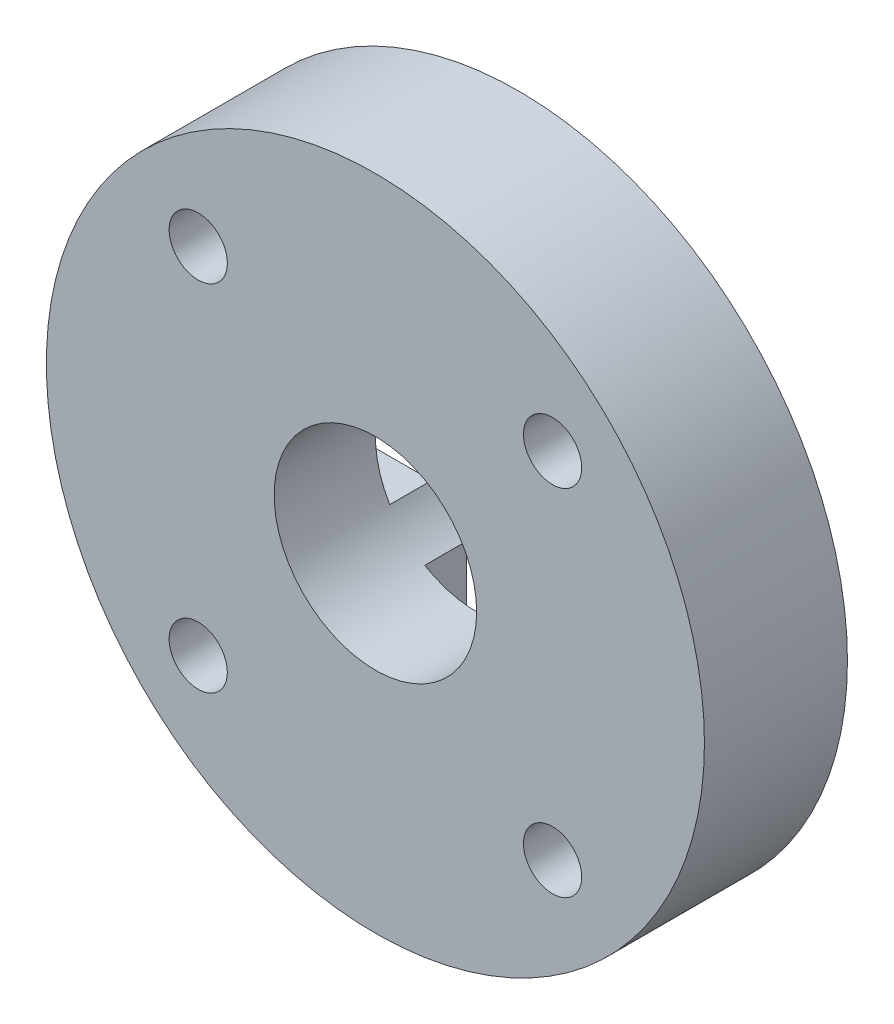
ISO-10303-21;
HEADER;
FILE_DESCRIPTION(('STEP AP214'),'2;1');
FILE_NAME('part.step','',(''),(''),'','','');
FILE_SCHEMA(('AUTOMOTIVE_DESIGN { 1 0 10303 214 1 1 1 1 }'));
ENDSEC;
DATA;
#1=APPLICATION_CONTEXT('core data for automotive mechanical design processes');
#2=APPLICATION_PROTOCOL_DEFINITION('international standard','automotive_design',2000,#1);
#3=PRODUCT_CONTEXT('',#1,'mechanical');
#4=PRODUCT('Part','Part','',(#3));
#5=PRODUCT_RELATED_PRODUCT_CATEGORY('part','',(#4));
#6=PRODUCT_DEFINITION_FORMATION('','',#4);
#7=PRODUCT_DEFINITION_CONTEXT('part definition',#1,'design');
#8=PRODUCT_DEFINITION('design','',#6,#7);
#9=PRODUCT_DEFINITION_SHAPE('','',#8);
#10=(LENGTH_UNIT() NAMED_UNIT(*) SI_UNIT(.MILLI.,.METRE.));
#11=(NAMED_UNIT(*) PLANE_ANGLE_UNIT() SI_UNIT($,.RADIAN.));
#12=(NAMED_UNIT(*) SI_UNIT($,.STERADIAN.) SOLID_ANGLE_UNIT());
#13=UNCERTAINTY_MEASURE_WITH_UNIT(LENGTH_MEASURE(1.E-05),#10,'distance_accuracy_value','');
#14=(GEOMETRIC_REPRESENTATION_CONTEXT(3) GLOBAL_UNCERTAINTY_ASSIGNED_CONTEXT((#13)) GLOBAL_UNIT_ASSIGNED_CONTEXT((#10,
#11,#12)) REPRESENTATION_CONTEXT('',''));
#15=CARTESIAN_POINT('',(0.,0.,0.));
#16=DIRECTION('',(0.,0.,1.));
#17=DIRECTION('',(1.,0.,0.));
#18=AXIS2_PLACEMENT_3D('',#15,#16,#17);
#19=CARTESIAN_POINT('',(0.,0.,-1.65));
#20=DIRECTION('',(0.,0.,1.));
#21=DIRECTION('',(1.,0.,0.));
#22=AXIS2_PLACEMENT_3D('',#19,#20,#21);
#23=PLANE('',#22);
#24=CARTESIAN_POINT('',(7.,-7.,-1.65));
#25=DIRECTION('',(0.,0.,1.));
#26=DIRECTION('',(1.,0.,0.));
#27=AXIS2_PLACEMENT_3D('',#24,#25,#26);
#28=CIRCLE('',#27,1.15);
#29=CARTESIAN_POINT('',(8.15,-7.,-1.65));
#30=VERTEX_POINT('',#29);
#31=EDGE_CURVE('E268',#30,#30,#28,.F.);
#32=ORIENTED_EDGE('',*,*,#31,.F.);
#33=EDGE_LOOP('',(#32));
#34=FACE_BOUND('',#33,.T.);
#35=CARTESIAN_POINT('',(-7.,-7.,-1.65));
#36=DIRECTION('',(0.,0.,1.));
#37=DIRECTION('',(1.,0.,0.));
#38=AXIS2_PLACEMENT_3D('',#35,#36,#37);
#39=CIRCLE('',#38,1.15);
#40=CARTESIAN_POINT('',(-5.85,-7.,-1.65));
#41=VERTEX_POINT('',#40);
#42=EDGE_CURVE('E289',#41,#41,#39,.F.);
#43=ORIENTED_EDGE('',*,*,#42,.F.);
#44=EDGE_LOOP('',(#43));
#45=FACE_BOUND('',#44,.T.);
#46=CARTESIAN_POINT('',(-7.,7.,-1.65));
#47=DIRECTION('',(0.,0.,1.));
#48=DIRECTION('',(1.,0.,0.));
#49=AXIS2_PLACEMENT_3D('',#46,#47,#48);
#50=CIRCLE('',#49,1.15);
#51=CARTESIAN_POINT('',(-5.85,7.,-1.65));
#52=VERTEX_POINT('',#51);
#53=EDGE_CURVE('E291',#52,#52,#50,.F.);
#54=ORIENTED_EDGE('',*,*,#53,.F.);
#55=EDGE_LOOP('',(#54));
#56=FACE_BOUND('',#55,.T.);
#57=CARTESIAN_POINT('',(7.,7.,-1.65));
#58=DIRECTION('',(0.,0.,1.));
#59=DIRECTION('',(1.,0.,0.));
#60=AXIS2_PLACEMENT_3D('',#57,#58,#59);
#61=CIRCLE('',#60,1.15);
#62=CARTESIAN_POINT('',(8.15,7.,-1.65));
#63=VERTEX_POINT('',#62);
#64=EDGE_CURVE('E300',#63,#63,#61,.F.);
#65=ORIENTED_EDGE('',*,*,#64,.F.);
#66=EDGE_LOOP('',(#65));
#67=FACE_BOUND('',#66,.T.);
#68=CARTESIAN_POINT('',(0.,0.,-1.65));
#69=DIRECTION('',(0.,0.,1.));
#70=DIRECTION('',(1.,0.,0.));
#71=AXIS2_PLACEMENT_3D('',#68,#69,#70);
#72=CIRCLE('',#71,13.);
#73=CARTESIAN_POINT('',(13.,0.,-1.65));
#74=VERTEX_POINT('',#73);
#75=EDGE_CURVE('E215',#74,#74,#72,.T.);
#76=ORIENTED_EDGE('',*,*,#75,.F.);
#77=EDGE_LOOP('',(#76));
#78=FACE_BOUND('',#77,.T.);
#79=DIRECTION('',(-1.,0.,0.));
#80=VECTOR('',#79,1.);
#81=CARTESIAN_POINT('',(-8.15,2.05,-1.65));
#82=LINE('',#81,#80);
#83=CARTESIAN_POINT('',(8.15,2.05,-1.65));
#84=VERTEX_POINT('',#83);
#85=CARTESIAN_POINT('',(3.43474889911912,2.05,-1.65));
#86=VERTEX_POINT('',#85);
#87=EDGE_CURVE('E172',#84,#86,#82,.T.);
#88=ORIENTED_EDGE('',*,*,#87,.T.);
#89=CARTESIAN_POINT('',(0.,0.,-1.65));
#90=DIRECTION('',(0.,0.,1.));
#91=DIRECTION('',(1.,0.,0.));
#92=AXIS2_PLACEMENT_3D('',#89,#90,#91);
#93=CIRCLE('',#92,4.);
#94=CARTESIAN_POINT('',(2.05,3.43474889911912,-1.65));
#95=VERTEX_POINT('',#94);
#96=EDGE_CURVE('E151',#86,#95,#93,.T.);
#97=ORIENTED_EDGE('',*,*,#96,.T.);
#98=DIRECTION('',(0.,1.,0.));
#99=VECTOR('',#98,1.);
#100=CARTESIAN_POINT('',(2.05,-8.15,-1.65));
#101=LINE('',#100,#99);
#102=CARTESIAN_POINT('',(2.05,8.15,-1.65));
#103=VERTEX_POINT('',#102);
#104=EDGE_CURVE('E226',#95,#103,#101,.T.);
#105=ORIENTED_EDGE('',*,*,#104,.T.);
#106=CARTESIAN_POINT('',(0.,8.15,-1.65));
#107=DIRECTION('',(0.,0.,1.));
#108=DIRECTION('',(1.,0.,0.));
#109=AXIS2_PLACEMENT_3D('',#106,#107,#108);
#110=CIRCLE('',#109,2.05);
#111=CARTESIAN_POINT('',(-2.05,8.15,-1.65));
#112=VERTEX_POINT('',#111);
#113=EDGE_CURVE('E274',#103,#112,#110,.T.);
#114=ORIENTED_EDGE('',*,*,#113,.T.);
#115=DIRECTION('',(0.,-1.,0.));
#116=VECTOR('',#115,1.);
#117=CARTESIAN_POINT('',(-2.05,-8.15,-1.65));
#118=LINE('',#117,#116);
#119=CARTESIAN_POINT('',(-2.05,3.43474889911912,-1.65));
#120=VERTEX_POINT('',#119);
#121=EDGE_CURVE('E238',#112,#120,#118,.T.);
#122=ORIENTED_EDGE('',*,*,#121,.T.);
#123=CARTESIAN_POINT('',(-3.43474889911912,2.05,-1.65));
#124=VERTEX_POINT('',#123);
#125=EDGE_CURVE('E62',#120,#124,#93,.T.);
#126=ORIENTED_EDGE('',*,*,#125,.T.);
#127=CARTESIAN_POINT('',(-8.15,2.05,-1.65));
#128=VERTEX_POINT('',#127);
#129=EDGE_CURVE('E187',#124,#128,#82,.T.);
#130=ORIENTED_EDGE('',*,*,#129,.T.);
#131=CARTESIAN_POINT('',(-8.15,0.,-1.65));
#132=DIRECTION('',(0.,0.,1.));
#133=DIRECTION('',(1.,0.,0.));
#134=AXIS2_PLACEMENT_3D('',#131,#132,#133);
#135=CIRCLE('',#134,2.05);
#136=CARTESIAN_POINT('',(-8.15,-2.05,-1.65));
#137=VERTEX_POINT('',#136);
#138=EDGE_CURVE('E278',#128,#137,#135,.T.);
#139=ORIENTED_EDGE('',*,*,#138,.T.);
#140=DIRECTION('',(1.,0.,0.));
#141=VECTOR('',#140,1.);
#142=CARTESIAN_POINT('',(-8.15,-2.05,-1.65));
#143=LINE('',#142,#141);
#144=CARTESIAN_POINT('',(-3.43474889911912,-2.05,-1.65));
#145=VERTEX_POINT('',#144);
#146=EDGE_CURVE('E194',#137,#145,#143,.T.);
#147=ORIENTED_EDGE('',*,*,#146,.T.);
#148=CARTESIAN_POINT('',(-2.05,-3.43474889911912,-1.65));
#149=VERTEX_POINT('',#148);
#150=EDGE_CURVE('E637',#145,#149,#93,.T.);
#151=ORIENTED_EDGE('',*,*,#150,.T.);
#152=CARTESIAN_POINT('',(-2.05,-8.15,-1.65));
#153=VERTEX_POINT('',#152);
#154=EDGE_CURVE('E53',#149,#153,#118,.T.);
#155=ORIENTED_EDGE('',*,*,#154,.T.);
#156=CARTESIAN_POINT('',(0.,-8.15,-1.65));
#157=DIRECTION('',(0.,0.,1.));
#158=DIRECTION('',(1.,0.,0.));
#159=AXIS2_PLACEMENT_3D('',#156,#157,#158);
#160=CIRCLE('',#159,2.05);
#161=CARTESIAN_POINT('',(2.05,-8.15,-1.65));
#162=VERTEX_POINT('',#161);
#163=EDGE_CURVE('E270',#153,#162,#160,.T.);
#164=ORIENTED_EDGE('',*,*,#163,.T.);
#165=CARTESIAN_POINT('',(2.05,-3.43474889911912,-1.65));
#166=VERTEX_POINT('',#165);
#167=EDGE_CURVE('E231',#162,#166,#101,.T.);
#168=ORIENTED_EDGE('',*,*,#167,.T.);
#169=CARTESIAN_POINT('',(3.43474889911912,-2.05,-1.65));
#170=VERTEX_POINT('',#169);
#171=EDGE_CURVE('E67',#166,#170,#93,.T.);
#172=ORIENTED_EDGE('',*,*,#171,.T.);
#173=CARTESIAN_POINT('',(8.15,-2.05,-1.65));
#174=VERTEX_POINT('',#173);
#175=EDGE_CURVE('E354',#170,#174,#143,.T.);
#176=ORIENTED_EDGE('',*,*,#175,.T.);
#177=CARTESIAN_POINT('',(8.15,0.,-1.65));
#178=DIRECTION('',(0.,0.,1.));
#179=DIRECTION('',(1.,0.,0.));
#180=AXIS2_PLACEMENT_3D('',#177,#178,#179);
#181=CIRCLE('',#180,2.05);
#182=EDGE_CURVE('E182',#174,#84,#181,.T.);
#183=ORIENTED_EDGE('',*,*,#182,.T.);
#184=EDGE_LOOP('',(#88,#97,#105,#114,#122,#126,#130,#139,#147,#151,#155,#164,#168,#172,#176,#183));
#185=FACE_BOUND('',#184,.T.);
#186=ADVANCED_FACE('F44',(#34,#45,#56,#67,#78,#185),#23,.F.);
#187=CARTESIAN_POINT('',(-8.15,-2.05,0.));
#188=DIRECTION('',(0.,1.,0.));
#189=DIRECTION('',(0.,0.,1.));
#190=AXIS2_PLACEMENT_3D('',#187,#188,#189);
#191=PLANE('',#190);
#192=ORIENTED_EDGE('',*,*,#175,.F.);
#193=DIRECTION('',(0.,0.,-1.));
#194=VECTOR('',#193,1.);
#195=CARTESIAN_POINT('',(3.43474889911912,-2.05,0.));
#196=LINE('',#195,#194);
#197=CARTESIAN_POINT('',(3.43474889911912,-2.05,0.));
#198=VERTEX_POINT('',#197);
#199=EDGE_CURVE('E178',#170,#198,#196,.F.);
#200=ORIENTED_EDGE('',*,*,#199,.T.);
#201=DIRECTION('',(1.,0.,0.));
#202=VECTOR('',#201,1.);
#203=CARTESIAN_POINT('',(-8.15,-2.05,0.));
#204=LINE('',#203,#202);
#205=CARTESIAN_POINT('',(8.15,-2.05,0.));
#206=VERTEX_POINT('',#205);
#207=EDGE_CURVE('E184',#198,#206,#204,.T.);
#208=ORIENTED_EDGE('',*,*,#207,.T.);
#209=DIRECTION('',(0.,0.,-1.));
#210=VECTOR('',#209,1.);
#211=CARTESIAN_POINT('',(8.15,-2.05,0.));
#212=LINE('',#211,#210);
#213=EDGE_CURVE('E204',#206,#174,#212,.T.);
#214=ORIENTED_EDGE('',*,*,#213,.T.);
#215=EDGE_LOOP('',(#192,#200,#208,#214));
#216=FACE_BOUND('',#215,.T.);
#217=ADVANCED_FACE('F407',(#216),#191,.T.);
#218=CARTESIAN_POINT('',(-8.15,2.05,0.));
#219=DIRECTION('',(0.,-1.,0.));
#220=DIRECTION('',(0.,0.,-1.));
#221=AXIS2_PLACEMENT_3D('',#218,#219,#220);
#222=PLANE('',#221);
#223=DIRECTION('',(-1.,0.,0.));
#224=VECTOR('',#223,1.);
#225=CARTESIAN_POINT('',(-8.15,2.05,0.));
#226=LINE('',#225,#224);
#227=CARTESIAN_POINT('',(8.15,2.05,0.));
#228=VERTEX_POINT('',#227);
#229=CARTESIAN_POINT('',(3.43474889911912,2.05,0.));
#230=VERTEX_POINT('',#229);
#231=EDGE_CURVE('E176',#228,#230,#226,.T.);
#232=ORIENTED_EDGE('',*,*,#231,.T.);
#233=DIRECTION('',(0.,0.,-1.));
#234=VECTOR('',#233,1.);
#235=CARTESIAN_POINT('',(3.43474889911912,2.05,0.));
#236=LINE('',#235,#234);
#237=EDGE_CURVE('E156',#230,#86,#236,.T.);
#238=ORIENTED_EDGE('',*,*,#237,.T.);
#239=ORIENTED_EDGE('',*,*,#87,.F.);
#240=DIRECTION('',(0.,0.,-1.));
#241=VECTOR('',#240,1.);
#242=CARTESIAN_POINT('',(8.15,2.05,0.));
#243=LINE('',#242,#241);
#244=EDGE_CURVE('E202',#228,#84,#243,.T.);
#245=ORIENTED_EDGE('',*,*,#244,.F.);
#246=EDGE_LOOP('',(#232,#238,#239,#245));
#247=FACE_BOUND('',#246,.T.);
#248=ADVANCED_FACE('F175',(#247),#222,.T.);
#249=ORIENTED_EDGE('',*,*,#129,.F.);
#250=DIRECTION('',(0.,0.,-1.));
#251=VECTOR('',#250,1.);
#252=CARTESIAN_POINT('',(-3.43474889911912,2.05,0.));
#253=LINE('',#252,#251);
#254=CARTESIAN_POINT('',(-3.43474889911912,2.05,0.));
#255=VERTEX_POINT('',#254);
#256=EDGE_CURVE('E177',#124,#255,#253,.F.);
#257=ORIENTED_EDGE('',*,*,#256,.T.);
#258=CARTESIAN_POINT('',(-8.15,2.05,0.));
#259=VERTEX_POINT('',#258);
#260=EDGE_CURVE('E359',#255,#259,#226,.T.);
#261=ORIENTED_EDGE('',*,*,#260,.T.);
#262=DIRECTION('',(0.,0.,-1.));
#263=VECTOR('',#262,1.);
#264=CARTESIAN_POINT('',(-8.15,2.05,0.));
#265=LINE('',#264,#263);
#266=EDGE_CURVE('E199',#259,#128,#265,.T.);
#267=ORIENTED_EDGE('',*,*,#266,.T.);
#268=EDGE_LOOP('',(#249,#257,#261,#267));
#269=FACE_BOUND('',#268,.T.);
#270=ADVANCED_FACE('F370',(#269),#222,.T.);
#271=CARTESIAN_POINT('',(-8.15,-2.05,0.));
#272=VERTEX_POINT('',#271);
#273=CARTESIAN_POINT('',(-3.43474889911912,-2.05,0.));
#274=VERTEX_POINT('',#273);
#275=EDGE_CURVE('E192',#272,#274,#204,.T.);
#276=ORIENTED_EDGE('',*,*,#275,.T.);
#277=DIRECTION('',(0.,0.,-1.));
#278=VECTOR('',#277,1.);
#279=CARTESIAN_POINT('',(-3.43474889911912,-2.05,0.));
#280=LINE('',#279,#278);
#281=EDGE_CURVE('E322',#274,#145,#280,.T.);
#282=ORIENTED_EDGE('',*,*,#281,.T.);
#283=ORIENTED_EDGE('',*,*,#146,.F.);
#284=DIRECTION('',(0.,0.,-1.));
#285=VECTOR('',#284,1.);
#286=CARTESIAN_POINT('',(-8.15,-2.05,0.));
#287=LINE('',#286,#285);
#288=EDGE_CURVE('E206',#272,#137,#287,.T.);
#289=ORIENTED_EDGE('',*,*,#288,.F.);
#290=EDGE_LOOP('',(#276,#282,#283,#289));
#291=FACE_BOUND('',#290,.T.);
#292=ADVANCED_FACE('F411',(#291),#191,.T.);
#293=CARTESIAN_POINT('',(2.05,-8.15,0.));
#294=DIRECTION('',(-1.,0.,0.));
#295=DIRECTION('',(0.,0.,1.));
#296=AXIS2_PLACEMENT_3D('',#293,#294,#295);
#297=PLANE('',#296);
#298=ORIENTED_EDGE('',*,*,#104,.F.);
#299=DIRECTION('',(0.,0.,-1.));
#300=VECTOR('',#299,1.);
#301=CARTESIAN_POINT('',(2.05,3.43474889911912,0.));
#302=LINE('',#301,#300);
#303=CARTESIAN_POINT('',(2.05,3.43474889911912,0.));
#304=VERTEX_POINT('',#303);
#305=EDGE_CURVE('E162',#95,#304,#302,.F.);
#306=ORIENTED_EDGE('',*,*,#305,.T.);
#307=DIRECTION('',(0.,1.,0.));
#308=VECTOR('',#307,1.);
#309=CARTESIAN_POINT('',(2.05,-8.15,0.));
#310=LINE('',#309,#308);
#311=CARTESIAN_POINT('',(2.05,8.15,0.));
#312=VERTEX_POINT('',#311);
#313=EDGE_CURVE('E258',#304,#312,#310,.T.);
#314=ORIENTED_EDGE('',*,*,#313,.T.);
#315=DIRECTION('',(0.,0.,-1.));
#316=VECTOR('',#315,1.);
#317=CARTESIAN_POINT('',(2.05,8.15,0.));
#318=LINE('',#317,#316);
#319=EDGE_CURVE('E346',#312,#103,#318,.T.);
#320=ORIENTED_EDGE('',*,*,#319,.T.);
#321=EDGE_LOOP('',(#298,#306,#314,#320));
#322=FACE_BOUND('',#321,.T.);
#323=ADVANCED_FACE('F393',(#322),#297,.T.);
#324=CARTESIAN_POINT('',(-2.05,-8.15,0.));
#325=DIRECTION('',(1.,0.,0.));
#326=DIRECTION('',(0.,0.,-1.));
#327=AXIS2_PLACEMENT_3D('',#324,#325,#326);
#328=PLANE('',#327);
#329=DIRECTION('',(0.,-1.,0.));
#330=VECTOR('',#329,1.);
#331=CARTESIAN_POINT('',(-2.05,-8.15,0.));
#332=LINE('',#331,#330);
#333=CARTESIAN_POINT('',(-2.05,8.15,0.));
#334=VERTEX_POINT('',#333);
#335=CARTESIAN_POINT('',(-2.05,3.43474889911912,0.));
#336=VERTEX_POINT('',#335);
#337=EDGE_CURVE('E247',#334,#336,#332,.T.);
#338=ORIENTED_EDGE('',*,*,#337,.T.);
#339=DIRECTION('',(0.,0.,-1.));
#340=VECTOR('',#339,1.);
#341=CARTESIAN_POINT('',(-2.05,3.43474889911912,0.));
#342=LINE('',#341,#340);
#343=EDGE_CURVE('E329',#336,#120,#342,.T.);
#344=ORIENTED_EDGE('',*,*,#343,.T.);
#345=ORIENTED_EDGE('',*,*,#121,.F.);
#346=DIRECTION('',(0.,0.,-1.));
#347=VECTOR('',#346,1.);
#348=CARTESIAN_POINT('',(-2.05,8.15,0.));
#349=LINE('',#348,#347);
#350=EDGE_CURVE('E256',#334,#112,#349,.T.);
#351=ORIENTED_EDGE('',*,*,#350,.F.);
#352=EDGE_LOOP('',(#338,#344,#345,#351));
#353=FACE_BOUND('',#352,.T.);
#354=ADVANCED_FACE('F387',(#353),#328,.T.);
#355=ORIENTED_EDGE('',*,*,#154,.F.);
#356=DIRECTION('',(0.,0.,-1.));
#357=VECTOR('',#356,1.);
#358=CARTESIAN_POINT('',(-2.05,-3.43474889911912,0.));
#359=LINE('',#358,#357);
#360=CARTESIAN_POINT('',(-2.05,-3.43474889911912,0.));
#361=VERTEX_POINT('',#360);
#362=EDGE_CURVE('E170',#149,#361,#359,.F.);
#363=ORIENTED_EDGE('',*,*,#362,.T.);
#364=CARTESIAN_POINT('',(-2.05,-8.15,0.));
#365=VERTEX_POINT('',#364);
#366=EDGE_CURVE('E245',#361,#365,#332,.T.);
#367=ORIENTED_EDGE('',*,*,#366,.T.);
#368=DIRECTION('',(0.,0.,-1.));
#369=VECTOR('',#368,1.);
#370=CARTESIAN_POINT('',(-2.05,-8.15,0.));
#371=LINE('',#370,#369);
#372=EDGE_CURVE('E350',#365,#153,#371,.T.);
#373=ORIENTED_EDGE('',*,*,#372,.T.);
#374=EDGE_LOOP('',(#355,#363,#367,#373));
#375=FACE_BOUND('',#374,.T.);
#376=ADVANCED_FACE('F334',(#375),#328,.T.);
#377=CARTESIAN_POINT('',(2.05,-8.15,0.));
#378=VERTEX_POINT('',#377);
#379=CARTESIAN_POINT('',(2.05,-3.43474889911912,0.));
#380=VERTEX_POINT('',#379);
#381=EDGE_CURVE('E257',#378,#380,#310,.T.);
#382=ORIENTED_EDGE('',*,*,#381,.T.);
#383=DIRECTION('',(0.,0.,-1.));
#384=VECTOR('',#383,1.);
#385=CARTESIAN_POINT('',(2.05,-3.43474889911912,0.));
#386=LINE('',#385,#384);
#387=EDGE_CURVE('E11',#380,#166,#386,.T.);
#388=ORIENTED_EDGE('',*,*,#387,.T.);
#389=ORIENTED_EDGE('',*,*,#167,.F.);
#390=DIRECTION('',(0.,0.,-1.));
#391=VECTOR('',#390,1.);
#392=CARTESIAN_POINT('',(2.05,-8.15,0.));
#393=LINE('',#392,#391);
#394=EDGE_CURVE('E343',#378,#162,#393,.T.);
#395=ORIENTED_EDGE('',*,*,#394,.F.);
#396=EDGE_LOOP('',(#382,#388,#389,#395));
#397=FACE_BOUND('',#396,.T.);
#398=ADVANCED_FACE('F344',(#397),#297,.T.);
#399=CARTESIAN_POINT('',(0.,0.,4.));
#400=DIRECTION('',(0.,0.,1.));
#401=DIRECTION('',(1.,0.,0.));
#402=AXIS2_PLACEMENT_3D('',#399,#400,#401);
#403=PLANE('',#402);
#404=CARTESIAN_POINT('',(7.,-7.,4.));
#405=DIRECTION('',(0.,0.,1.));
#406=DIRECTION('',(1.,0.,0.));
#407=AXIS2_PLACEMENT_3D('',#404,#405,#406);
#408=CIRCLE('',#407,1.15);
#409=CARTESIAN_POINT('',(8.15,-7.,4.));
#410=VERTEX_POINT('',#409);
#411=EDGE_CURVE('E306',#410,#410,#408,.T.);
#412=ORIENTED_EDGE('',*,*,#411,.F.);
#413=EDGE_LOOP('',(#412));
#414=FACE_BOUND('',#413,.T.);
#415=CARTESIAN_POINT('',(-7.,-7.,4.));
#416=DIRECTION('',(0.,0.,1.));
#417=DIRECTION('',(1.,0.,0.));
#418=AXIS2_PLACEMENT_3D('',#415,#416,#417);
#419=CIRCLE('',#418,1.15);
#420=CARTESIAN_POINT('',(-5.85,-7.,4.));
#421=VERTEX_POINT('',#420);
#422=EDGE_CURVE('E309',#421,#421,#419,.T.);
#423=ORIENTED_EDGE('',*,*,#422,.F.);
#424=EDGE_LOOP('',(#423));
#425=FACE_BOUND('',#424,.T.);
#426=CARTESIAN_POINT('',(-7.,7.,4.));
#427=DIRECTION('',(0.,0.,1.));
#428=DIRECTION('',(1.,0.,0.));
#429=AXIS2_PLACEMENT_3D('',#426,#427,#428);
#430=CIRCLE('',#429,1.15);
#431=CARTESIAN_POINT('',(-5.85,7.,4.));
#432=VERTEX_POINT('',#431);
#433=EDGE_CURVE('E304',#432,#432,#430,.T.);
#434=ORIENTED_EDGE('',*,*,#433,.F.);
#435=EDGE_LOOP('',(#434));
#436=FACE_BOUND('',#435,.T.);
#437=CARTESIAN_POINT('',(7.,7.,4.));
#438=DIRECTION('',(0.,0.,1.));
#439=DIRECTION('',(1.,0.,0.));
#440=AXIS2_PLACEMENT_3D('',#437,#438,#439);
#441=CIRCLE('',#440,1.15);
#442=CARTESIAN_POINT('',(8.15,7.,4.));
#443=VERTEX_POINT('',#442);
#444=EDGE_CURVE('E301',#443,#443,#441,.T.);
#445=ORIENTED_EDGE('',*,*,#444,.F.);
#446=EDGE_LOOP('',(#445));
#447=FACE_BOUND('',#446,.T.);
#448=CARTESIAN_POINT('',(0.,0.,4.));
#449=DIRECTION('',(0.,0.,1.));
#450=DIRECTION('',(1.,0.,0.));
#451=AXIS2_PLACEMENT_3D('',#448,#449,#450);
#452=CIRCLE('',#451,13.);
#453=CARTESIAN_POINT('',(13.,0.,4.));
#454=VERTEX_POINT('',#453);
#455=EDGE_CURVE('E225',#454,#454,#452,.T.);
#456=ORIENTED_EDGE('',*,*,#455,.T.);
#457=EDGE_LOOP('',(#456));
#458=FACE_BOUND('',#457,.T.);
#459=CARTESIAN_POINT('',(0.,0.,4.));
#460=DIRECTION('',(0.,0.,1.));
#461=DIRECTION('',(1.,0.,0.));
#462=AXIS2_PLACEMENT_3D('',#459,#460,#461);
#463=CIRCLE('',#462,4.);
#464=CARTESIAN_POINT('',(4.,0.,4.));
#465=VERTEX_POINT('',#464);
#466=EDGE_CURVE('E217',#465,#465,#463,.T.);
#467=ORIENTED_EDGE('',*,*,#466,.F.);
#468=EDGE_LOOP('',(#467));
#469=FACE_BOUND('',#468,.T.);
#470=ADVANCED_FACE('F421',(#414,#425,#436,#447,#458,#469),#403,.T.);
#471=CARTESIAN_POINT('',(0.,0.,4.));
#472=DIRECTION('',(0.,0.,-1.));
#473=DIRECTION('',(-1.,0.,0.));
#474=AXIS2_PLACEMENT_3D('',#471,#472,#473);
#475=CYLINDRICAL_SURFACE('',#474,13.);
#476=ORIENTED_EDGE('',*,*,#455,.F.);
#477=EDGE_LOOP('',(#476));
#478=FACE_BOUND('',#477,.T.);
#479=ORIENTED_EDGE('',*,*,#75,.T.);
#480=EDGE_LOOP('',(#479));
#481=FACE_BOUND('',#480,.T.);
#482=ADVANCED_FACE('F50',(#478,#481),#475,.T.);
#483=CARTESIAN_POINT('',(0.,0.,4.));
#484=DIRECTION('',(0.,0.,-1.));
#485=DIRECTION('',(-1.,0.,0.));
#486=AXIS2_PLACEMENT_3D('',#483,#484,#485);
#487=CYLINDRICAL_SURFACE('',#486,4.);
#488=ORIENTED_EDGE('',*,*,#466,.T.);
#489=EDGE_LOOP('',(#488));
#490=FACE_BOUND('',#489,.T.);
#491=CARTESIAN_POINT('',(0.,0.,0.));
#492=DIRECTION('',(0.,0.,1.));
#493=DIRECTION('',(1.,0.,0.));
#494=AXIS2_PLACEMENT_3D('',#491,#492,#493);
#495=CIRCLE('',#494,4.);
#496=EDGE_CURVE('E223',#304,#336,#495,.T.);
#497=ORIENTED_EDGE('',*,*,#496,.F.);
#498=ORIENTED_EDGE('',*,*,#305,.F.);
#499=ORIENTED_EDGE('',*,*,#96,.F.);
#500=ORIENTED_EDGE('',*,*,#237,.F.);
#501=EDGE_CURVE('E212',#198,#230,#495,.T.);
#502=ORIENTED_EDGE('',*,*,#501,.F.);
#503=ORIENTED_EDGE('',*,*,#199,.F.);
#504=ORIENTED_EDGE('',*,*,#171,.F.);
#505=ORIENTED_EDGE('',*,*,#387,.F.);
#506=EDGE_CURVE('E218',#361,#380,#495,.T.);
#507=ORIENTED_EDGE('',*,*,#506,.F.);
#508=ORIENTED_EDGE('',*,*,#362,.F.);
#509=ORIENTED_EDGE('',*,*,#150,.F.);
#510=ORIENTED_EDGE('',*,*,#281,.F.);
#511=EDGE_CURVE('E219',#255,#274,#495,.T.);
#512=ORIENTED_EDGE('',*,*,#511,.F.);
#513=ORIENTED_EDGE('',*,*,#256,.F.);
#514=ORIENTED_EDGE('',*,*,#125,.F.);
#515=ORIENTED_EDGE('',*,*,#343,.F.);
#516=EDGE_LOOP('',(#497,#498,#499,#500,#502,#503,#504,#505,#507,#508,#509,#510,#512,#513,#514,#515));
#517=FACE_BOUND('',#516,.T.);
#518=ADVANCED_FACE('F158',(#490,#517),#487,.F.);
#519=CARTESIAN_POINT('',(0.,0.,0.));
#520=DIRECTION('',(0.,0.,-1.));
#521=DIRECTION('',(-1.,0.,0.));
#522=AXIS2_PLACEMENT_3D('',#519,#520,#521);
#523=PLANE('',#522);
#524=ORIENTED_EDGE('',*,*,#231,.F.);
#525=CARTESIAN_POINT('',(8.15,0.,0.));
#526=DIRECTION('',(0.,0.,1.));
#527=DIRECTION('',(1.,0.,0.));
#528=AXIS2_PLACEMENT_3D('',#525,#526,#527);
#529=CIRCLE('',#528,2.05);
#530=EDGE_CURVE('E252',#206,#228,#529,.T.);
#531=ORIENTED_EDGE('',*,*,#530,.F.);
#532=ORIENTED_EDGE('',*,*,#207,.F.);
#533=ORIENTED_EDGE('',*,*,#501,.T.);
#534=EDGE_LOOP('',(#524,#531,#532,#533));
#535=FACE_BOUND('',#534,.T.);
#536=ADVANCED_FACE('F423',(#535),#523,.T.);
#537=ORIENTED_EDGE('',*,*,#275,.F.);
#538=CARTESIAN_POINT('',(-8.15,0.,0.));
#539=DIRECTION('',(0.,0.,1.));
#540=DIRECTION('',(1.,0.,0.));
#541=AXIS2_PLACEMENT_3D('',#538,#539,#540);
#542=CIRCLE('',#541,2.05);
#543=EDGE_CURVE('E280',#259,#272,#542,.T.);
#544=ORIENTED_EDGE('',*,*,#543,.F.);
#545=ORIENTED_EDGE('',*,*,#260,.F.);
#546=ORIENTED_EDGE('',*,*,#511,.T.);
#547=EDGE_LOOP('',(#537,#544,#545,#546));
#548=FACE_BOUND('',#547,.T.);
#549=ADVANCED_FACE('F373',(#548),#523,.T.);
#550=CARTESIAN_POINT('',(0.,0.,0.));
#551=DIRECTION('',(0.,0.,-1.));
#552=DIRECTION('',(-1.,0.,0.));
#553=AXIS2_PLACEMENT_3D('',#550,#551,#552);
#554=PLANE('',#553);
#555=ORIENTED_EDGE('',*,*,#337,.F.);
#556=CARTESIAN_POINT('',(0.,8.15,0.));
#557=DIRECTION('',(0.,0.,1.));
#558=DIRECTION('',(1.,0.,0.));
#559=AXIS2_PLACEMENT_3D('',#556,#557,#558);
#560=CIRCLE('',#559,2.05);
#561=EDGE_CURVE('E272',#312,#334,#560,.T.);
#562=ORIENTED_EDGE('',*,*,#561,.F.);
#563=ORIENTED_EDGE('',*,*,#313,.F.);
#564=ORIENTED_EDGE('',*,*,#496,.T.);
#565=EDGE_LOOP('',(#555,#562,#563,#564));
#566=FACE_BOUND('',#565,.T.);
#567=ADVANCED_FACE('F382',(#566),#554,.T.);
#568=ORIENTED_EDGE('',*,*,#381,.F.);
#569=CARTESIAN_POINT('',(0.,-8.15,0.));
#570=DIRECTION('',(0.,0.,1.));
#571=DIRECTION('',(1.,0.,0.));
#572=AXIS2_PLACEMENT_3D('',#569,#570,#571);
#573=CIRCLE('',#572,2.05);
#574=EDGE_CURVE('E265',#365,#378,#573,.T.);
#575=ORIENTED_EDGE('',*,*,#574,.F.);
#576=ORIENTED_EDGE('',*,*,#366,.F.);
#577=ORIENTED_EDGE('',*,*,#506,.T.);
#578=EDGE_LOOP('',(#568,#575,#576,#577));
#579=FACE_BOUND('',#578,.T.);
#580=ADVANCED_FACE('F342',(#579),#554,.T.);
#581=CARTESIAN_POINT('',(0.,-8.15,0.));
#582=DIRECTION('',(0.,0.,-1.));
#583=DIRECTION('',(-1.,0.,0.));
#584=AXIS2_PLACEMENT_3D('',#581,#582,#583);
#585=CYLINDRICAL_SURFACE('',#584,2.05);
#586=ORIENTED_EDGE('',*,*,#163,.F.);
#587=ORIENTED_EDGE('',*,*,#372,.F.);
#588=ORIENTED_EDGE('',*,*,#574,.T.);
#589=ORIENTED_EDGE('',*,*,#394,.T.);
#590=EDGE_LOOP('',(#586,#587,#588,#589));
#591=FACE_BOUND('',#590,.T.);
#592=ADVANCED_FACE('F391',(#591),#585,.F.);
#593=CARTESIAN_POINT('',(0.,8.15,0.));
#594=DIRECTION('',(0.,0.,-1.));
#595=DIRECTION('',(-1.,0.,0.));
#596=AXIS2_PLACEMENT_3D('',#593,#594,#595);
#597=CYLINDRICAL_SURFACE('',#596,2.05);
#598=ORIENTED_EDGE('',*,*,#319,.F.);
#599=ORIENTED_EDGE('',*,*,#561,.T.);
#600=ORIENTED_EDGE('',*,*,#350,.T.);
#601=ORIENTED_EDGE('',*,*,#113,.F.);
#602=EDGE_LOOP('',(#598,#599,#600,#601));
#603=FACE_BOUND('',#602,.T.);
#604=ADVANCED_FACE('F394',(#603),#597,.F.);
#605=CARTESIAN_POINT('',(-8.15,0.,0.));
#606=DIRECTION('',(0.,0.,-1.));
#607=DIRECTION('',(-1.,0.,0.));
#608=AXIS2_PLACEMENT_3D('',#605,#606,#607);
#609=CYLINDRICAL_SURFACE('',#608,2.05);
#610=ORIENTED_EDGE('',*,*,#543,.T.);
#611=ORIENTED_EDGE('',*,*,#288,.T.);
#612=ORIENTED_EDGE('',*,*,#138,.F.);
#613=ORIENTED_EDGE('',*,*,#266,.F.);
#614=EDGE_LOOP('',(#610,#611,#612,#613));
#615=FACE_BOUND('',#614,.T.);
#616=ADVANCED_FACE('F395',(#615),#609,.F.);
#617=CARTESIAN_POINT('',(8.15,0.,0.));
#618=DIRECTION('',(0.,0.,-1.));
#619=DIRECTION('',(-1.,0.,0.));
#620=AXIS2_PLACEMENT_3D('',#617,#618,#619);
#621=CYLINDRICAL_SURFACE('',#620,2.05);
#622=ORIENTED_EDGE('',*,*,#182,.F.);
#623=ORIENTED_EDGE('',*,*,#213,.F.);
#624=ORIENTED_EDGE('',*,*,#530,.T.);
#625=ORIENTED_EDGE('',*,*,#244,.T.);
#626=EDGE_LOOP('',(#622,#623,#624,#625));
#627=FACE_BOUND('',#626,.T.);
#628=ADVANCED_FACE('F402',(#627),#621,.F.);
#629=CARTESIAN_POINT('',(7.,7.,4.));
#630=DIRECTION('',(0.,0.,-1.));
#631=DIRECTION('',(-1.,0.,0.));
#632=AXIS2_PLACEMENT_3D('',#629,#630,#631);
#633=CYLINDRICAL_SURFACE('',#632,1.15);
#634=ORIENTED_EDGE('',*,*,#444,.T.);
#635=EDGE_LOOP('',(#634));
#636=FACE_BOUND('',#635,.T.);
#637=ORIENTED_EDGE('',*,*,#64,.T.);
#638=EDGE_LOOP('',(#637));
#639=FACE_BOUND('',#638,.T.);
#640=ADVANCED_FACE('F443',(#636,#639),#633,.F.);
#641=CARTESIAN_POINT('',(-7.,7.,4.));
#642=DIRECTION('',(0.,0.,-1.));
#643=DIRECTION('',(-1.,0.,0.));
#644=AXIS2_PLACEMENT_3D('',#641,#642,#643);
#645=CYLINDRICAL_SURFACE('',#644,1.15);
#646=ORIENTED_EDGE('',*,*,#433,.T.);
#647=EDGE_LOOP('',(#646));
#648=FACE_BOUND('',#647,.T.);
#649=ORIENTED_EDGE('',*,*,#53,.T.);
#650=EDGE_LOOP('',(#649));
#651=FACE_BOUND('',#650,.T.);
#652=ADVANCED_FACE('F447',(#648,#651),#645,.F.);
#653=CARTESIAN_POINT('',(-7.,-7.,4.));
#654=DIRECTION('',(0.,0.,-1.));
#655=DIRECTION('',(-1.,0.,0.));
#656=AXIS2_PLACEMENT_3D('',#653,#654,#655);
#657=CYLINDRICAL_SURFACE('',#656,1.15);
#658=ORIENTED_EDGE('',*,*,#422,.T.);
#659=EDGE_LOOP('',(#658));
#660=FACE_BOUND('',#659,.T.);
#661=ORIENTED_EDGE('',*,*,#42,.T.);
#662=EDGE_LOOP('',(#661));
#663=FACE_BOUND('',#662,.T.);
#664=ADVANCED_FACE('F458',(#660,#663),#657,.F.);
#665=CARTESIAN_POINT('',(7.,-7.,4.));
#666=DIRECTION('',(0.,0.,-1.));
#667=DIRECTION('',(-1.,0.,0.));
#668=AXIS2_PLACEMENT_3D('',#665,#666,#667);
#669=CYLINDRICAL_SURFACE('',#668,1.15);
#670=ORIENTED_EDGE('',*,*,#411,.T.);
#671=EDGE_LOOP('',(#670));
#672=FACE_BOUND('',#671,.T.);
#673=ORIENTED_EDGE('',*,*,#31,.T.);
#674=EDGE_LOOP('',(#673));
#675=FACE_BOUND('',#674,.T.);
#676=ADVANCED_FACE('F465',(#672,#675),#669,.F.);
#677=CLOSED_SHELL('',(#186,#217,#248,#270,#292,#323,#354,#376,#398,#470,#482,#518,#536,#549,
#567,#580,#592,#604,#616,#628,#640,#652,#664,#676));
#678=MANIFOLD_SOLID_BREP('B2',#677);
#679=ADVANCED_BREP_SHAPE_REPRESENTATION('',(#18,#678),#14);
#680=SHAPE_DEFINITION_REPRESENTATION(#9,#679);
ENDSEC;
END-ISO-10303-21;
